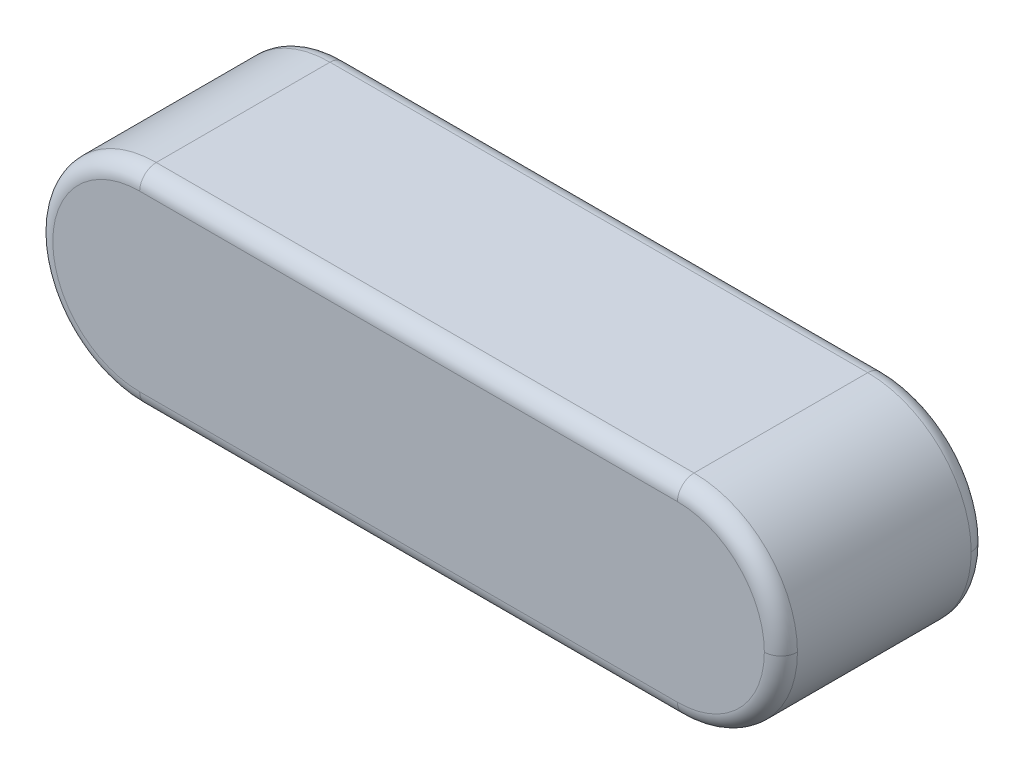
ISO-10303-21;
HEADER;
FILE_DESCRIPTION(('STEP AP214'),'2;1');
FILE_NAME('part.step','',(''),(''),'','','');
FILE_SCHEMA(('AUTOMOTIVE_DESIGN { 1 0 10303 214 1 1 1 1 }'));
ENDSEC;
DATA;
#1=APPLICATION_CONTEXT('core data for automotive mechanical design processes');
#2=APPLICATION_PROTOCOL_DEFINITION('international standard','automotive_design',2000,#1);
#3=PRODUCT_CONTEXT('',#1,'mechanical');
#4=PRODUCT('Part','Part','',(#3));
#5=PRODUCT_RELATED_PRODUCT_CATEGORY('part','',(#4));
#6=PRODUCT_DEFINITION_FORMATION('','',#4);
#7=PRODUCT_DEFINITION_CONTEXT('part definition',#1,'design');
#8=PRODUCT_DEFINITION('design','',#6,#7);
#9=PRODUCT_DEFINITION_SHAPE('','',#8);
#10=(LENGTH_UNIT() NAMED_UNIT(*) SI_UNIT(.MILLI.,.METRE.));
#11=(NAMED_UNIT(*) PLANE_ANGLE_UNIT() SI_UNIT($,.RADIAN.));
#12=(NAMED_UNIT(*) SI_UNIT($,.STERADIAN.) SOLID_ANGLE_UNIT());
#13=UNCERTAINTY_MEASURE_WITH_UNIT(LENGTH_MEASURE(1.E-05),#10,'distance_accuracy_value','');
#14=(GEOMETRIC_REPRESENTATION_CONTEXT(3) GLOBAL_UNCERTAINTY_ASSIGNED_CONTEXT((#13)) GLOBAL_UNIT_ASSIGNED_CONTEXT((#10,
#11,#12)) REPRESENTATION_CONTEXT('',''));
#15=CARTESIAN_POINT('',(0.,0.,0.));
#16=DIRECTION('',(0.,0.,1.));
#17=DIRECTION('',(1.,0.,0.));
#18=AXIS2_PLACEMENT_3D('',#15,#16,#17);
#19=CARTESIAN_POINT('',(6.5,0.,0.4));
#20=DIRECTION('',(0.,0.,1.));
#21=DIRECTION('',(1.,0.,0.));
#22=AXIS2_PLACEMENT_3D('',#19,#20,#21);
#23=TOROIDAL_SURFACE('',#22,2.1,0.4);
#24=CARTESIAN_POINT('',(8.6,0.,0.4));
#25=DIRECTION('',(0.,-1.,0.));
#26=DIRECTION('',(0.,0.,-1.));
#27=AXIS2_PLACEMENT_3D('',#24,#25,#26);
#28=CIRCLE('',#27,0.4);
#29=CARTESIAN_POINT('',(8.6,0.,0.));
#30=VERTEX_POINT('',#29);
#31=CARTESIAN_POINT('',(9.,0.,0.4));
#32=VERTEX_POINT('',#31);
#33=EDGE_CURVE('E209',#30,#32,#28,.T.);
#34=ORIENTED_EDGE('',*,*,#33,.F.);
#35=CARTESIAN_POINT('',(6.5,0.,0.));
#36=DIRECTION('',(0.,0.,-1.));
#37=DIRECTION('',(1.,0.,0.));
#38=AXIS2_PLACEMENT_3D('',#35,#36,#37);
#39=CIRCLE('',#38,2.1);
#40=CARTESIAN_POINT('',(6.5,2.1,0.));
#41=VERTEX_POINT('',#40);
#42=EDGE_CURVE('E231',#41,#30,#39,.T.);
#43=ORIENTED_EDGE('',*,*,#42,.F.);
#44=CARTESIAN_POINT('',(6.5,2.1,0.4));
#45=DIRECTION('',(1.,0.,0.));
#46=DIRECTION('',(0.,0.,-1.));
#47=AXIS2_PLACEMENT_3D('',#44,#45,#46);
#48=CIRCLE('',#47,0.4);
#49=CARTESIAN_POINT('',(6.5,2.5,0.4));
#50=VERTEX_POINT('',#49);
#51=EDGE_CURVE('E10',#41,#50,#48,.T.);
#52=ORIENTED_EDGE('',*,*,#51,.T.);
#53=CARTESIAN_POINT('',(6.5,0.,0.4));
#54=DIRECTION('',(0.,0.,1.));
#55=DIRECTION('',(1.,0.,0.));
#56=AXIS2_PLACEMENT_3D('',#53,#54,#55);
#57=CIRCLE('',#56,2.5);
#58=EDGE_CURVE('E257',#32,#50,#57,.T.);
#59=ORIENTED_EDGE('',*,*,#58,.F.);
#60=EDGE_LOOP('',(#34,#43,#52,#59));
#61=FACE_BOUND('',#60,.T.);
#62=ADVANCED_FACE('F16',(#61),#23,.T.);
#63=CARTESIAN_POINT('',(-6.5,2.1,0.4));
#64=DIRECTION('',(-1.,0.,0.));
#65=DIRECTION('',(0.,-1.,0.));
#66=AXIS2_PLACEMENT_3D('',#63,#64,#65);
#67=CYLINDRICAL_SURFACE('',#66,0.4);
#68=CARTESIAN_POINT('',(-6.5,2.1,0.4));
#69=DIRECTION('',(1.,0.,0.));
#70=DIRECTION('',(0.,0.,-1.));
#71=AXIS2_PLACEMENT_3D('',#68,#69,#70);
#72=CIRCLE('',#71,0.4);
#73=CARTESIAN_POINT('',(-6.5,2.1,0.));
#74=VERTEX_POINT('',#73);
#75=CARTESIAN_POINT('',(-6.5,2.5,0.4));
#76=VERTEX_POINT('',#75);
#77=EDGE_CURVE('E142',#74,#76,#72,.T.);
#78=ORIENTED_EDGE('',*,*,#77,.T.);
#79=DIRECTION('',(-1.,0.,0.));
#80=VECTOR('',#79,1.);
#81=CARTESIAN_POINT('',(-6.5,2.5,0.4));
#82=LINE('',#81,#80);
#83=EDGE_CURVE('E20',#50,#76,#82,.T.);
#84=ORIENTED_EDGE('',*,*,#83,.F.);
#85=ORIENTED_EDGE('',*,*,#51,.F.);
#86=DIRECTION('',(1.,0.,0.));
#87=VECTOR('',#86,1.);
#88=CARTESIAN_POINT('',(-6.5,2.1,0.));
#89=LINE('',#88,#87);
#90=EDGE_CURVE('E223',#74,#41,#89,.T.);
#91=ORIENTED_EDGE('',*,*,#90,.F.);
#92=EDGE_LOOP('',(#78,#84,#85,#91));
#93=FACE_BOUND('',#92,.T.);
#94=ADVANCED_FACE('F18',(#93),#67,.T.);
#95=CARTESIAN_POINT('',(-6.5,-2.1,0.4));
#96=DIRECTION('',(1.,0.,0.));
#97=DIRECTION('',(0.,1.,0.));
#98=AXIS2_PLACEMENT_3D('',#95,#96,#97);
#99=CYLINDRICAL_SURFACE('',#98,0.4);
#100=CARTESIAN_POINT('',(-6.5,-2.1,0.4));
#101=DIRECTION('',(1.,0.,0.));
#102=DIRECTION('',(0.,0.,-1.));
#103=AXIS2_PLACEMENT_3D('',#100,#101,#102);
#104=CIRCLE('',#103,0.4);
#105=CARTESIAN_POINT('',(-6.5,-2.5,0.4));
#106=VERTEX_POINT('',#105);
#107=CARTESIAN_POINT('',(-6.5,-2.1,0.));
#108=VERTEX_POINT('',#107);
#109=EDGE_CURVE('E27',#106,#108,#104,.T.);
#110=ORIENTED_EDGE('',*,*,#109,.T.);
#111=DIRECTION('',(-1.,0.,0.));
#112=VECTOR('',#111,1.);
#113=CARTESIAN_POINT('',(-6.5,-2.1,0.));
#114=LINE('',#113,#112);
#115=CARTESIAN_POINT('',(6.5,-2.1,0.));
#116=VERTEX_POINT('',#115);
#117=EDGE_CURVE('E234',#116,#108,#114,.T.);
#118=ORIENTED_EDGE('',*,*,#117,.F.);
#119=CARTESIAN_POINT('',(6.5,-2.1,0.4));
#120=DIRECTION('',(1.,0.,0.));
#121=DIRECTION('',(0.,0.,-1.));
#122=AXIS2_PLACEMENT_3D('',#119,#120,#121);
#123=CIRCLE('',#122,0.4);
#124=CARTESIAN_POINT('',(6.5,-2.5,0.4));
#125=VERTEX_POINT('',#124);
#126=EDGE_CURVE('E150',#125,#116,#123,.T.);
#127=ORIENTED_EDGE('',*,*,#126,.F.);
#128=DIRECTION('',(1.,0.,0.));
#129=VECTOR('',#128,1.);
#130=CARTESIAN_POINT('',(-6.5,-2.5,0.4));
#131=LINE('',#130,#129);
#132=EDGE_CURVE('E146',#106,#125,#131,.T.);
#133=ORIENTED_EDGE('',*,*,#132,.F.);
#134=EDGE_LOOP('',(#110,#118,#127,#133));
#135=FACE_BOUND('',#134,.T.);
#136=ADVANCED_FACE('F148',(#135),#99,.T.);
#137=CARTESIAN_POINT('',(-6.5,0.,0.4));
#138=DIRECTION('',(0.,0.,1.));
#139=DIRECTION('',(1.,0.,0.));
#140=AXIS2_PLACEMENT_3D('',#137,#138,#139);
#141=TOROIDAL_SURFACE('',#140,2.1,0.4);
#142=ORIENTED_EDGE('',*,*,#77,.F.);
#143=CARTESIAN_POINT('',(-6.5,0.,0.));
#144=DIRECTION('',(0.,0.,-1.));
#145=DIRECTION('',(1.,0.,0.));
#146=AXIS2_PLACEMENT_3D('',#143,#144,#145);
#147=CIRCLE('',#146,2.1);
#148=EDGE_CURVE('E139',#108,#74,#147,.T.);
#149=ORIENTED_EDGE('',*,*,#148,.F.);
#150=ORIENTED_EDGE('',*,*,#109,.F.);
#151=CARTESIAN_POINT('',(-6.5,0.,0.4));
#152=DIRECTION('',(0.,0.,1.));
#153=DIRECTION('',(1.,0.,0.));
#154=AXIS2_PLACEMENT_3D('',#151,#152,#153);
#155=CIRCLE('',#154,2.5);
#156=CARTESIAN_POINT('',(-9.,0.,0.4));
#157=VERTEX_POINT('',#156);
#158=EDGE_CURVE('E136',#157,#106,#155,.T.);
#159=ORIENTED_EDGE('',*,*,#158,.F.);
#160=CARTESIAN_POINT('',(-6.5,0.,0.4));
#161=DIRECTION('',(0.,0.,1.));
#162=DIRECTION('',(1.,0.,0.));
#163=AXIS2_PLACEMENT_3D('',#160,#161,#162);
#164=CIRCLE('',#163,2.5);
#165=EDGE_CURVE('E212',#76,#157,#164,.T.);
#166=ORIENTED_EDGE('',*,*,#165,.F.);
#167=EDGE_LOOP('',(#142,#149,#150,#159,#166));
#168=FACE_BOUND('',#167,.T.);
#169=ADVANCED_FACE('F133',(#168),#141,.T.);
#170=CARTESIAN_POINT('',(6.5,0.,4.6));
#171=DIRECTION('',(0.,0.,1.));
#172=DIRECTION('',(1.,0.,0.));
#173=AXIS2_PLACEMENT_3D('',#170,#171,#172);
#174=TOROIDAL_SURFACE('',#173,2.1,0.4);
#175=CARTESIAN_POINT('',(8.6,0.,4.6));
#176=DIRECTION('',(0.,-1.,0.));
#177=DIRECTION('',(0.,0.,-1.));
#178=AXIS2_PLACEMENT_3D('',#175,#176,#177);
#179=CIRCLE('',#178,0.4);
#180=CARTESIAN_POINT('',(9.,0.,4.6));
#181=VERTEX_POINT('',#180);
#182=CARTESIAN_POINT('',(8.6,0.,5.));
#183=VERTEX_POINT('',#182);
#184=EDGE_CURVE('E180',#181,#183,#179,.T.);
#185=ORIENTED_EDGE('',*,*,#184,.F.);
#186=CARTESIAN_POINT('',(6.5,0.,4.6));
#187=DIRECTION('',(0.,0.,-1.));
#188=DIRECTION('',(1.,0.,0.));
#189=AXIS2_PLACEMENT_3D('',#186,#187,#188);
#190=CIRCLE('',#189,2.5);
#191=CARTESIAN_POINT('',(6.5,2.5,4.6));
#192=VERTEX_POINT('',#191);
#193=EDGE_CURVE('E252',#192,#181,#190,.T.);
#194=ORIENTED_EDGE('',*,*,#193,.F.);
#195=CARTESIAN_POINT('',(6.5,2.1,4.6));
#196=DIRECTION('',(1.,0.,0.));
#197=DIRECTION('',(0.,0.,-1.));
#198=AXIS2_PLACEMENT_3D('',#195,#196,#197);
#199=CIRCLE('',#198,0.4);
#200=CARTESIAN_POINT('',(6.5,2.1,5.));
#201=VERTEX_POINT('',#200);
#202=EDGE_CURVE('E202',#192,#201,#199,.T.);
#203=ORIENTED_EDGE('',*,*,#202,.T.);
#204=CARTESIAN_POINT('',(6.5,0.,5.));
#205=DIRECTION('',(0.,0.,1.));
#206=DIRECTION('',(1.,0.,0.));
#207=AXIS2_PLACEMENT_3D('',#204,#205,#206);
#208=CIRCLE('',#207,2.1);
#209=EDGE_CURVE('E92',#183,#201,#208,.T.);
#210=ORIENTED_EDGE('',*,*,#209,.F.);
#211=EDGE_LOOP('',(#185,#194,#203,#210));
#212=FACE_BOUND('',#211,.T.);
#213=ADVANCED_FACE('F579',(#212),#174,.T.);
#214=CARTESIAN_POINT('',(-6.5,2.1,4.6));
#215=DIRECTION('',(1.,0.,0.));
#216=DIRECTION('',(0.,1.,0.));
#217=AXIS2_PLACEMENT_3D('',#214,#215,#216);
#218=CYLINDRICAL_SURFACE('',#217,0.4);
#219=CARTESIAN_POINT('',(-6.5,2.1,4.6));
#220=DIRECTION('',(1.,0.,0.));
#221=DIRECTION('',(0.,0.,-1.));
#222=AXIS2_PLACEMENT_3D('',#219,#220,#221);
#223=CIRCLE('',#222,0.4);
#224=CARTESIAN_POINT('',(-6.5,2.5,4.6));
#225=VERTEX_POINT('',#224);
#226=CARTESIAN_POINT('',(-6.5,2.1,5.));
#227=VERTEX_POINT('',#226);
#228=EDGE_CURVE('E235',#225,#227,#223,.T.);
#229=ORIENTED_EDGE('',*,*,#228,.T.);
#230=DIRECTION('',(-1.,0.,0.));
#231=VECTOR('',#230,1.);
#232=CARTESIAN_POINT('',(-6.5,2.1,5.));
#233=LINE('',#232,#231);
#234=EDGE_CURVE('E224',#201,#227,#233,.T.);
#235=ORIENTED_EDGE('',*,*,#234,.F.);
#236=ORIENTED_EDGE('',*,*,#202,.F.);
#237=DIRECTION('',(1.,0.,0.));
#238=VECTOR('',#237,1.);
#239=CARTESIAN_POINT('',(6.5,2.5,4.6));
#240=LINE('',#239,#238);
#241=EDGE_CURVE('E266',#225,#192,#240,.T.);
#242=ORIENTED_EDGE('',*,*,#241,.F.);
#243=EDGE_LOOP('',(#229,#235,#236,#242));
#244=FACE_BOUND('',#243,.T.);
#245=ADVANCED_FACE('F476',(#244),#218,.T.);
#246=CARTESIAN_POINT('',(-6.5,-2.1,4.6));
#247=DIRECTION('',(-1.,0.,0.));
#248=DIRECTION('',(0.,-1.,0.));
#249=AXIS2_PLACEMENT_3D('',#246,#247,#248);
#250=CYLINDRICAL_SURFACE('',#249,0.4);
#251=CARTESIAN_POINT('',(-6.5,-2.1,4.6));
#252=DIRECTION('',(1.,0.,0.));
#253=DIRECTION('',(0.,0.,-1.));
#254=AXIS2_PLACEMENT_3D('',#251,#252,#253);
#255=CIRCLE('',#254,0.4);
#256=CARTESIAN_POINT('',(-6.5,-2.1,5.));
#257=VERTEX_POINT('',#256);
#258=CARTESIAN_POINT('',(-6.5,-2.5,4.6));
#259=VERTEX_POINT('',#258);
#260=EDGE_CURVE('E204',#257,#259,#255,.T.);
#261=ORIENTED_EDGE('',*,*,#260,.T.);
#262=DIRECTION('',(-1.,0.,0.));
#263=VECTOR('',#262,1.);
#264=CARTESIAN_POINT('',(-6.5,-2.5,4.6));
#265=LINE('',#264,#263);
#266=CARTESIAN_POINT('',(6.5,-2.5,4.6));
#267=VERTEX_POINT('',#266);
#268=EDGE_CURVE('E79',#267,#259,#265,.T.);
#269=ORIENTED_EDGE('',*,*,#268,.F.);
#270=CARTESIAN_POINT('',(6.5,-2.1,4.6));
#271=DIRECTION('',(1.,0.,0.));
#272=DIRECTION('',(0.,0.,-1.));
#273=AXIS2_PLACEMENT_3D('',#270,#271,#272);
#274=CIRCLE('',#273,0.4);
#275=CARTESIAN_POINT('',(6.5,-2.1,5.));
#276=VERTEX_POINT('',#275);
#277=EDGE_CURVE('E179',#276,#267,#274,.T.);
#278=ORIENTED_EDGE('',*,*,#277,.F.);
#279=DIRECTION('',(1.,0.,0.));
#280=VECTOR('',#279,1.);
#281=CARTESIAN_POINT('',(6.5,-2.1,5.));
#282=LINE('',#281,#280);
#283=EDGE_CURVE('E225',#257,#276,#282,.T.);
#284=ORIENTED_EDGE('',*,*,#283,.F.);
#285=EDGE_LOOP('',(#261,#269,#278,#284));
#286=FACE_BOUND('',#285,.T.);
#287=ADVANCED_FACE('F287',(#286),#250,.T.);
#288=CARTESIAN_POINT('',(-6.5,0.,4.6));
#289=DIRECTION('',(0.,0.,1.));
#290=DIRECTION('',(1.,0.,0.));
#291=AXIS2_PLACEMENT_3D('',#288,#289,#290);
#292=TOROIDAL_SURFACE('',#291,2.1,0.4);
#293=ORIENTED_EDGE('',*,*,#228,.F.);
#294=CARTESIAN_POINT('',(-6.5,0.,4.6));
#295=DIRECTION('',(0.,0.,-1.));
#296=DIRECTION('',(1.,0.,0.));
#297=AXIS2_PLACEMENT_3D('',#294,#295,#296);
#298=CIRCLE('',#297,2.5);
#299=CARTESIAN_POINT('',(-9.,0.,4.6));
#300=VERTEX_POINT('',#299);
#301=EDGE_CURVE('E164',#300,#225,#298,.T.);
#302=ORIENTED_EDGE('',*,*,#301,.F.);
#303=CARTESIAN_POINT('',(-6.5,0.,4.6));
#304=DIRECTION('',(0.,0.,-1.));
#305=DIRECTION('',(1.,0.,0.));
#306=AXIS2_PLACEMENT_3D('',#303,#304,#305);
#307=CIRCLE('',#306,2.5);
#308=EDGE_CURVE('E174',#259,#300,#307,.T.);
#309=ORIENTED_EDGE('',*,*,#308,.F.);
#310=ORIENTED_EDGE('',*,*,#260,.F.);
#311=CARTESIAN_POINT('',(-6.5,0.,5.));
#312=DIRECTION('',(0.,0.,1.));
#313=DIRECTION('',(1.,0.,0.));
#314=AXIS2_PLACEMENT_3D('',#311,#312,#313);
#315=CIRCLE('',#314,2.1);
#316=EDGE_CURVE('E219',#227,#257,#315,.T.);
#317=ORIENTED_EDGE('',*,*,#316,.F.);
#318=EDGE_LOOP('',(#293,#302,#309,#310,#317));
#319=FACE_BOUND('',#318,.T.);
#320=ADVANCED_FACE('F292',(#319),#292,.T.);
#321=CARTESIAN_POINT('',(-6.5,0.,0.));
#322=DIRECTION('',(0.,0.,1.));
#323=DIRECTION('',(1.,0.,0.));
#324=AXIS2_PLACEMENT_3D('',#321,#322,#323);
#325=PLANE('',#324);
#326=ORIENTED_EDGE('',*,*,#90,.T.);
#327=ORIENTED_EDGE('',*,*,#42,.T.);
#328=CARTESIAN_POINT('',(6.5,0.,0.));
#329=DIRECTION('',(0.,0.,-1.));
#330=DIRECTION('',(1.,0.,0.));
#331=AXIS2_PLACEMENT_3D('',#328,#329,#330);
#332=CIRCLE('',#331,2.1);
#333=EDGE_CURVE('E241',#30,#116,#332,.T.);
#334=ORIENTED_EDGE('',*,*,#333,.T.);
#335=ORIENTED_EDGE('',*,*,#117,.T.);
#336=ORIENTED_EDGE('',*,*,#148,.T.);
#337=EDGE_LOOP('',(#326,#327,#334,#335,#336));
#338=FACE_BOUND('',#337,.T.);
#339=ADVANCED_FACE('F405',(#338),#325,.F.);
#340=CARTESIAN_POINT('',(-6.5,0.,5.));
#341=DIRECTION('',(0.,0.,1.));
#342=DIRECTION('',(1.,0.,0.));
#343=AXIS2_PLACEMENT_3D('',#340,#341,#342);
#344=PLANE('',#343);
#345=ORIENTED_EDGE('',*,*,#283,.T.);
#346=CARTESIAN_POINT('',(6.5,0.,5.));
#347=DIRECTION('',(0.,0.,1.));
#348=DIRECTION('',(1.,0.,0.));
#349=AXIS2_PLACEMENT_3D('',#346,#347,#348);
#350=CIRCLE('',#349,2.1);
#351=EDGE_CURVE('E177',#276,#183,#350,.T.);
#352=ORIENTED_EDGE('',*,*,#351,.T.);
#353=ORIENTED_EDGE('',*,*,#209,.T.);
#354=ORIENTED_EDGE('',*,*,#234,.T.);
#355=ORIENTED_EDGE('',*,*,#316,.T.);
#356=EDGE_LOOP('',(#345,#352,#353,#354,#355));
#357=FACE_BOUND('',#356,.T.);
#358=ADVANCED_FACE('F288',(#357),#344,.T.);
#359=CARTESIAN_POINT('',(-6.5,2.5,5.));
#360=DIRECTION('',(0.,-1.,0.));
#361=DIRECTION('',(0.,0.,-1.));
#362=AXIS2_PLACEMENT_3D('',#359,#360,#361);
#363=PLANE('',#362);
#364=DIRECTION('',(0.,0.,-1.));
#365=VECTOR('',#364,1.);
#366=CARTESIAN_POINT('',(-6.5,2.5,5.));
#367=LINE('',#366,#365);
#368=EDGE_CURVE('E216',#225,#76,#367,.T.);
#369=ORIENTED_EDGE('',*,*,#368,.F.);
#370=ORIENTED_EDGE('',*,*,#241,.T.);
#371=DIRECTION('',(0.,0.,-1.));
#372=VECTOR('',#371,1.);
#373=CARTESIAN_POINT('',(6.5,2.5,5.));
#374=LINE('',#373,#372);
#375=EDGE_CURVE('E155',#192,#50,#374,.T.);
#376=ORIENTED_EDGE('',*,*,#375,.T.);
#377=ORIENTED_EDGE('',*,*,#83,.T.);
#378=EDGE_LOOP('',(#369,#370,#376,#377));
#379=FACE_BOUND('',#378,.T.);
#380=ADVANCED_FACE('F432',(#379),#363,.F.);
#381=CARTESIAN_POINT('',(6.5,0.,5.));
#382=DIRECTION('',(0.,0.,-1.));
#383=DIRECTION('',(-1.,0.,0.));
#384=AXIS2_PLACEMENT_3D('',#381,#382,#383);
#385=CYLINDRICAL_SURFACE('',#384,2.5);
#386=ORIENTED_EDGE('',*,*,#375,.F.);
#387=ORIENTED_EDGE('',*,*,#193,.T.);
#388=CARTESIAN_POINT('',(6.5,0.,4.6));
#389=DIRECTION('',(0.,0.,-1.));
#390=DIRECTION('',(1.,0.,0.));
#391=AXIS2_PLACEMENT_3D('',#388,#389,#390);
#392=CIRCLE('',#391,2.5);
#393=EDGE_CURVE('E191',#181,#267,#392,.T.);
#394=ORIENTED_EDGE('',*,*,#393,.T.);
#395=DIRECTION('',(0.,0.,-1.));
#396=VECTOR('',#395,1.);
#397=CARTESIAN_POINT('',(6.5,-2.5,5.));
#398=LINE('',#397,#396);
#399=EDGE_CURVE('E215',#267,#125,#398,.T.);
#400=ORIENTED_EDGE('',*,*,#399,.T.);
#401=CARTESIAN_POINT('',(6.5,0.,0.4));
#402=DIRECTION('',(0.,0.,1.));
#403=DIRECTION('',(1.,0.,0.));
#404=AXIS2_PLACEMENT_3D('',#401,#402,#403);
#405=CIRCLE('',#404,2.5);
#406=EDGE_CURVE('E205',#125,#32,#405,.T.);
#407=ORIENTED_EDGE('',*,*,#406,.T.);
#408=ORIENTED_EDGE('',*,*,#58,.T.);
#409=EDGE_LOOP('',(#386,#387,#394,#400,#407,#408));
#410=FACE_BOUND('',#409,.T.);
#411=ADVANCED_FACE('F284',(#410),#385,.T.);
#412=CARTESIAN_POINT('',(-6.5,-2.5,5.));
#413=DIRECTION('',(0.,1.,0.));
#414=DIRECTION('',(1.,0.,0.));
#415=AXIS2_PLACEMENT_3D('',#412,#413,#414);
#416=PLANE('',#415);
#417=ORIENTED_EDGE('',*,*,#399,.F.);
#418=ORIENTED_EDGE('',*,*,#268,.T.);
#419=DIRECTION('',(0.,0.,-1.));
#420=VECTOR('',#419,1.);
#421=CARTESIAN_POINT('',(-6.5,-2.5,5.));
#422=LINE('',#421,#420);
#423=EDGE_CURVE('E158',#259,#106,#422,.T.);
#424=ORIENTED_EDGE('',*,*,#423,.T.);
#425=ORIENTED_EDGE('',*,*,#132,.T.);
#426=EDGE_LOOP('',(#417,#418,#424,#425));
#427=FACE_BOUND('',#426,.T.);
#428=ADVANCED_FACE('F159',(#427),#416,.F.);
#429=CARTESIAN_POINT('',(-6.5,0.,5.));
#430=DIRECTION('',(0.,0.,-1.));
#431=DIRECTION('',(-1.,0.,0.));
#432=AXIS2_PLACEMENT_3D('',#429,#430,#431);
#433=CYLINDRICAL_SURFACE('',#432,2.5);
#434=DIRECTION('',(0.,0.,-1.));
#435=VECTOR('',#434,1.);
#436=CARTESIAN_POINT('',(-9.,0.,5.));
#437=LINE('',#436,#435);
#438=EDGE_CURVE('E168',#300,#157,#437,.T.);
#439=ORIENTED_EDGE('',*,*,#438,.F.);
#440=ORIENTED_EDGE('',*,*,#301,.T.);
#441=ORIENTED_EDGE('',*,*,#368,.T.);
#442=ORIENTED_EDGE('',*,*,#165,.T.);
#443=EDGE_LOOP('',(#439,#440,#441,#442));
#444=FACE_BOUND('',#443,.T.);
#445=ADVANCED_FACE('F428',(#444),#433,.T.);
#446=CARTESIAN_POINT('',(-6.5,0.,5.));
#447=DIRECTION('',(0.,0.,-1.));
#448=DIRECTION('',(-1.,0.,0.));
#449=AXIS2_PLACEMENT_3D('',#446,#447,#448);
#450=CYLINDRICAL_SURFACE('',#449,2.5);
#451=ORIENTED_EDGE('',*,*,#308,.T.);
#452=ORIENTED_EDGE('',*,*,#438,.T.);
#453=ORIENTED_EDGE('',*,*,#158,.T.);
#454=ORIENTED_EDGE('',*,*,#423,.F.);
#455=EDGE_LOOP('',(#451,#452,#453,#454));
#456=FACE_BOUND('',#455,.T.);
#457=ADVANCED_FACE('F166',(#456),#450,.T.);
#458=CARTESIAN_POINT('',(6.5,0.,4.6));
#459=DIRECTION('',(0.,0.,1.));
#460=DIRECTION('',(1.,0.,0.));
#461=AXIS2_PLACEMENT_3D('',#458,#459,#460);
#462=TOROIDAL_SURFACE('',#461,2.1,0.4);
#463=ORIENTED_EDGE('',*,*,#393,.F.);
#464=ORIENTED_EDGE('',*,*,#184,.T.);
#465=ORIENTED_EDGE('',*,*,#351,.F.);
#466=ORIENTED_EDGE('',*,*,#277,.T.);
#467=EDGE_LOOP('',(#463,#464,#465,#466));
#468=FACE_BOUND('',#467,.T.);
#469=ADVANCED_FACE('F285',(#468),#462,.T.);
#470=CARTESIAN_POINT('',(6.5,0.,0.4));
#471=DIRECTION('',(0.,0.,1.));
#472=DIRECTION('',(1.,0.,0.));
#473=AXIS2_PLACEMENT_3D('',#470,#471,#472);
#474=TOROIDAL_SURFACE('',#473,2.1,0.4);
#475=ORIENTED_EDGE('',*,*,#333,.F.);
#476=ORIENTED_EDGE('',*,*,#33,.T.);
#477=ORIENTED_EDGE('',*,*,#406,.F.);
#478=ORIENTED_EDGE('',*,*,#126,.T.);
#479=EDGE_LOOP('',(#475,#476,#477,#478));
#480=FACE_BOUND('',#479,.T.);
#481=ADVANCED_FACE('F411',(#480),#474,.T.);
#482=CLOSED_SHELL('',(#62,#94,#136,#169,#213,#245,#287,#320,#339,#358,#380,#411,#428,#445,#457,
#469,#481));
#483=MANIFOLD_SOLID_BREP('B1',#482);
#484=ADVANCED_BREP_SHAPE_REPRESENTATION('',(#18,#483),#14);
#485=SHAPE_DEFINITION_REPRESENTATION(#9,#484);
ENDSEC;
END-ISO-10303-21;
